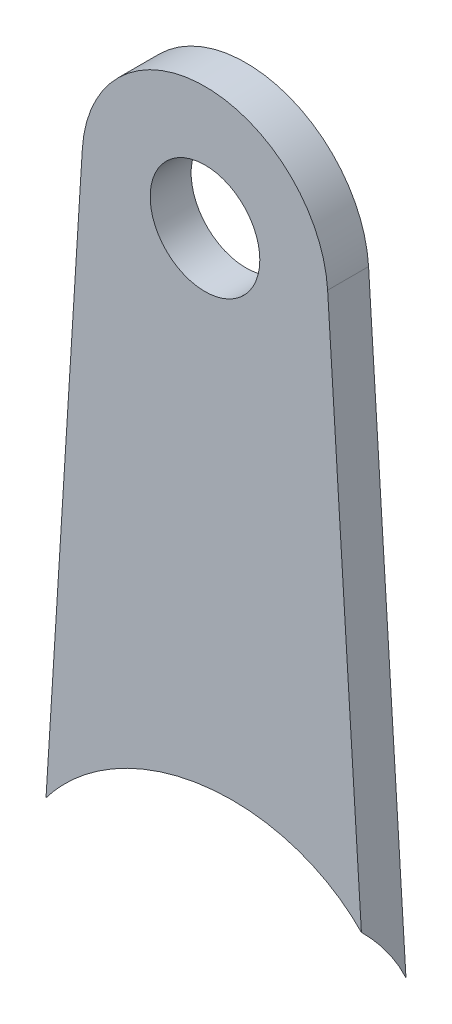
ISO-10303-21;
HEADER;
FILE_DESCRIPTION(('STEP AP214'),'2;1');
FILE_NAME('part.step','',(''),(''),'','','');
FILE_SCHEMA(('AUTOMOTIVE_DESIGN { 1 0 10303 214 1 1 1 1 }'));
ENDSEC;
DATA;
#1=APPLICATION_CONTEXT('core data for automotive mechanical design processes');
#2=APPLICATION_PROTOCOL_DEFINITION('international standard','automotive_design',2000,#1);
#3=PRODUCT_CONTEXT('',#1,'mechanical');
#4=PRODUCT('Part','Part','',(#3));
#5=PRODUCT_RELATED_PRODUCT_CATEGORY('part','',(#4));
#6=PRODUCT_DEFINITION_FORMATION('','',#4);
#7=PRODUCT_DEFINITION_CONTEXT('part definition',#1,'design');
#8=PRODUCT_DEFINITION('design','',#6,#7);
#9=PRODUCT_DEFINITION_SHAPE('','',#8);
#10=(LENGTH_UNIT() NAMED_UNIT(*) SI_UNIT(.MILLI.,.METRE.));
#11=(NAMED_UNIT(*) PLANE_ANGLE_UNIT() SI_UNIT($,.RADIAN.));
#12=(NAMED_UNIT(*) SI_UNIT($,.STERADIAN.) SOLID_ANGLE_UNIT());
#13=UNCERTAINTY_MEASURE_WITH_UNIT(LENGTH_MEASURE(1.E-05),#10,'distance_accuracy_value','');
#14=(GEOMETRIC_REPRESENTATION_CONTEXT(3) GLOBAL_UNCERTAINTY_ASSIGNED_CONTEXT((#13)) GLOBAL_UNIT_ASSIGNED_CONTEXT((#10,
#11,#12)) REPRESENTATION_CONTEXT('',''));
#15=CARTESIAN_POINT('',(0.,0.,0.));
#16=DIRECTION('',(0.,0.,1.));
#17=DIRECTION('',(1.,0.,0.));
#18=AXIS2_PLACEMENT_3D('',#15,#16,#17);
#19=CARTESIAN_POINT('',(-9.50637741735107,0.595326296141552,-3.175));
#20=DIRECTION('',(-0.998044873212711,0.0625014484138113,0.));
#21=DIRECTION('',(-0.0625014484138113,-0.998044873212711,0.));
#22=AXIS2_PLACEMENT_3D('',#19,#20,#21);
#23=PLANE('',#22);
#24=DIRECTION('',(0.0625014484138113,0.998044873212711,0.));
#25=VECTOR('',#24,1.);
#26=CARTESIAN_POINT('',(-9.50637741735107,0.595326296141552,0.));
#27=LINE('',#26,#25);
#28=CARTESIAN_POINT('',(-12.3240433394191,-44.3981434443891,0.));
#29=VERTEX_POINT('',#28);
#30=CARTESIAN_POINT('',(-9.50637741735107,0.595326296141553,0.));
#31=VERTEX_POINT('',#30);
#32=EDGE_CURVE('E48',#29,#31,#27,.T.);
#33=ORIENTED_EDGE('',*,*,#32,.T.);
#34=DIRECTION('',(0.,0.,1.));
#35=VECTOR('',#34,1.);
#36=CARTESIAN_POINT('',(-9.50637741735107,0.595326296141553,-3.175));
#37=LINE('',#36,#35);
#38=CARTESIAN_POINT('',(-9.50637741735107,0.595326296141553,-3.175));
#39=VERTEX_POINT('',#38);
#40=EDGE_CURVE('E101',#39,#31,#37,.T.);
#41=ORIENTED_EDGE('',*,*,#40,.F.);
#42=DIRECTION('',(0.0625014484138113,0.998044873212711,0.));
#43=VECTOR('',#42,1.);
#44=CARTESIAN_POINT('',(-9.50637741735107,0.595326296141552,-3.175));
#45=LINE('',#44,#43);
#46=CARTESIAN_POINT('',(-12.230088095016,-42.8978334136986,-3.175));
#47=VERTEX_POINT('',#46);
#48=EDGE_CURVE('E115',#47,#39,#45,.T.);
#49=ORIENTED_EDGE('',*,*,#48,.F.);
#50=CARTESIAN_POINT('',(-13.0371618119993,-55.7854673163059,-20.0662296507242));
#51=DIRECTION('',(0.998044873212711,-0.0625014484138113,0.));
#52=DIRECTION('',(0.0182386214460947,0.291240652668135,0.956475945814209));
#53=AXIS2_PLACEMENT_3D('',#50,#51,#52);
#54=ELLIPSE('',#53,24.5531990618858,12.7);
#55=EDGE_CURVE('E103',#29,#47,#54,.F.);
#56=ORIENTED_EDGE('',*,*,#55,.F.);
#57=EDGE_LOOP('',(#33,#41,#49,#56));
#58=FACE_BOUND('',#57,.T.);
#59=ADVANCED_FACE('F45',(#58),#23,.T.);
#60=CARTESIAN_POINT('',(9.50637741735107,0.595326296141555,-3.175));
#61=DIRECTION('',(-0.998044873212711,-0.0625014484138115,0.));
#62=DIRECTION('',(0.0625014484138115,-0.998044873212711,0.));
#63=AXIS2_PLACEMENT_3D('',#60,#61,#62);
#64=PLANE('',#63);
#65=CARTESIAN_POINT('',(12.3877374629447,-45.4152333687308,19.0666640768086));
#66=DIRECTION('',(0.998044873212711,0.0625014484138115,0.));
#67=DIRECTION('',(-0.0136544969017709,0.218039757077051,0.975844362102964));
#68=AXIS2_PLACEMENT_3D('',#65,#66,#67);
#69=ELLIPSE('',#68,23.3301226325283,12.7);
#70=CARTESIAN_POINT('',(12.1239681467757,-41.2032731599001,0.));
#71=VERTEX_POINT('',#70);
#72=CARTESIAN_POINT('',(12.4064909578693,-45.7146957002345,-3.175));
#73=VERTEX_POINT('',#72);
#74=EDGE_CURVE('E11',#71,#73,#69,.F.);
#75=ORIENTED_EDGE('',*,*,#74,.T.);
#76=DIRECTION('',(-0.0625014484138115,0.998044873212711,0.));
#77=VECTOR('',#76,1.);
#78=CARTESIAN_POINT('',(9.50637741735107,0.595326296141555,-3.175));
#79=LINE('',#78,#77);
#80=CARTESIAN_POINT('',(9.50637741735107,0.595326296141555,-3.175));
#81=VERTEX_POINT('',#80);
#82=EDGE_CURVE('E105',#73,#81,#79,.T.);
#83=ORIENTED_EDGE('',*,*,#82,.T.);
#84=DIRECTION('',(0.,0.,1.));
#85=VECTOR('',#84,1.);
#86=CARTESIAN_POINT('',(9.50637741735107,0.595326296141555,-3.175));
#87=LINE('',#86,#85);
#88=CARTESIAN_POINT('',(9.50637741735107,0.595326296141555,0.));
#89=VERTEX_POINT('',#88);
#90=EDGE_CURVE('E99',#81,#89,#87,.T.);
#91=ORIENTED_EDGE('',*,*,#90,.T.);
#92=DIRECTION('',(-0.0625014484138115,0.998044873212711,0.));
#93=VECTOR('',#92,1.);
#94=CARTESIAN_POINT('',(9.50637741735107,0.595326296141555,0.));
#95=LINE('',#94,#93);
#96=EDGE_CURVE('E90',#71,#89,#95,.T.);
#97=ORIENTED_EDGE('',*,*,#96,.F.);
#98=EDGE_LOOP('',(#75,#83,#91,#97));
#99=FACE_BOUND('',#98,.T.);
#100=ADVANCED_FACE('F96',(#99),#64,.F.);
#101=CARTESIAN_POINT('',(0.,0.,-3.175));
#102=DIRECTION('',(0.,0.,1.));
#103=DIRECTION('',(-1.,0.,0.));
#104=AXIS2_PLACEMENT_3D('',#101,#102,#103);
#105=CYLINDRICAL_SURFACE('',#104,9.525);
#106=CARTESIAN_POINT('',(0.,0.,0.));
#107=DIRECTION('',(0.,0.,1.));
#108=DIRECTION('',(1.,0.,0.));
#109=AXIS2_PLACEMENT_3D('',#106,#107,#108);
#110=CIRCLE('',#109,9.525);
#111=EDGE_CURVE('E100',#89,#31,#110,.T.);
#112=ORIENTED_EDGE('',*,*,#111,.F.);
#113=ORIENTED_EDGE('',*,*,#90,.F.);
#114=CARTESIAN_POINT('',(0.,0.,-3.175));
#115=DIRECTION('',(0.,0.,1.));
#116=DIRECTION('',(1.,0.,0.));
#117=AXIS2_PLACEMENT_3D('',#114,#115,#116);
#118=CIRCLE('',#117,9.525);
#119=EDGE_CURVE('E110',#81,#39,#118,.T.);
#120=ORIENTED_EDGE('',*,*,#119,.T.);
#121=ORIENTED_EDGE('',*,*,#40,.T.);
#122=EDGE_LOOP('',(#112,#113,#120,#121));
#123=FACE_BOUND('',#122,.T.);
#124=ADVANCED_FACE('F131',(#123),#105,.T.);
#125=CARTESIAN_POINT('',(0.,0.,-3.175));
#126=DIRECTION('',(0.,0.,1.));
#127=DIRECTION('',(-1.,0.,0.));
#128=AXIS2_PLACEMENT_3D('',#125,#126,#127);
#129=CYLINDRICAL_SURFACE('',#128,4.25);
#130=CARTESIAN_POINT('',(0.,0.,-3.175));
#131=DIRECTION('',(0.,0.,1.));
#132=DIRECTION('',(1.,0.,0.));
#133=AXIS2_PLACEMENT_3D('',#130,#131,#132);
#134=CIRCLE('',#133,4.25);
#135=CARTESIAN_POINT('',(4.25,0.,-3.175));
#136=VERTEX_POINT('',#135);
#137=EDGE_CURVE('E106',#136,#136,#134,.T.);
#138=ORIENTED_EDGE('',*,*,#137,.F.);
#139=EDGE_LOOP('',(#138));
#140=FACE_BOUND('',#139,.T.);
#141=CARTESIAN_POINT('',(0.,0.,0.));
#142=DIRECTION('',(0.,0.,1.));
#143=DIRECTION('',(1.,0.,0.));
#144=AXIS2_PLACEMENT_3D('',#141,#142,#143);
#145=CIRCLE('',#144,4.25);
#146=CARTESIAN_POINT('',(4.25,0.,0.));
#147=VERTEX_POINT('',#146);
#148=EDGE_CURVE('E93',#147,#147,#145,.T.);
#149=ORIENTED_EDGE('',*,*,#148,.T.);
#150=EDGE_LOOP('',(#149));
#151=FACE_BOUND('',#150,.T.);
#152=ADVANCED_FACE('F128',(#140,#151),#129,.F.);
#153=CARTESIAN_POINT('',(0.,0.,-3.175));
#154=DIRECTION('',(0.,0.,-1.));
#155=DIRECTION('',(1.,0.,0.));
#156=AXIS2_PLACEMENT_3D('',#153,#154,#155);
#157=PLANE('',#156);
#158=ORIENTED_EDGE('',*,*,#48,.T.);
#159=ORIENTED_EDGE('',*,*,#119,.F.);
#160=ORIENTED_EDGE('',*,*,#82,.F.);
#161=CARTESIAN_POINT('',(-2.06281845038238,-51.3092840736395,-3.17500000000001));
#162=DIRECTION('',(0.,0.,1.));
#163=DIRECTION('',(0.925940325935361,0.377669846303248,0.));
#164=AXIS2_PLACEMENT_3D('',#161,#162,#163);
#165=ELLIPSE('',#164,15.5145140746698,12.7);
#166=EDGE_CURVE('E63',#47,#73,#165,.F.);
#167=ORIENTED_EDGE('',*,*,#166,.F.);
#168=EDGE_LOOP('',(#158,#159,#160,#167));
#169=FACE_BOUND('',#168,.T.);
#170=ORIENTED_EDGE('',*,*,#137,.T.);
#171=EDGE_LOOP('',(#170));
#172=FACE_BOUND('',#171,.T.);
#173=ADVANCED_FACE('F108',(#169,#172),#157,.T.);
#174=CARTESIAN_POINT('',(0.,0.,0.));
#175=DIRECTION('',(0.,0.,-1.));
#176=DIRECTION('',(1.,0.,0.));
#177=AXIS2_PLACEMENT_3D('',#174,#175,#176);
#178=PLANE('',#177);
#179=CARTESIAN_POINT('',(-1.5404344466674E-12,-50.4679076854583,0.));
#180=DIRECTION('',(0.,0.,1.));
#181=DIRECTION('',(0.925940325935361,0.377669846303248,0.));
#182=AXIS2_PLACEMENT_3D('',#179,#180,#181);
#183=ELLIPSE('',#182,15.5145140746698,12.7);
#184=EDGE_CURVE('E54',#29,#71,#183,.F.);
#185=ORIENTED_EDGE('',*,*,#184,.T.);
#186=ORIENTED_EDGE('',*,*,#96,.T.);
#187=ORIENTED_EDGE('',*,*,#111,.T.);
#188=ORIENTED_EDGE('',*,*,#32,.F.);
#189=EDGE_LOOP('',(#185,#186,#187,#188));
#190=FACE_BOUND('',#189,.T.);
#191=ORIENTED_EDGE('',*,*,#148,.F.);
#192=EDGE_LOOP('',(#191));
#193=FACE_BOUND('',#192,.T.);
#194=ADVANCED_FACE('F88',(#190,#193),#178,.F.);
#195=CARTESIAN_POINT('',(-123.025911317865,-100.647358474362,-189.356105653459));
#196=DIRECTION('',(0.531842232493444,0.2169262625002,0.818588319226511));
#197=DIRECTION('',(0.455152304592379,0.741924356505789,-0.492325734496703));
#198=AXIS2_PLACEMENT_3D('',#195,#196,#197);
#199=CYLINDRICAL_SURFACE('',#198,12.7);
#200=ORIENTED_EDGE('',*,*,#55,.T.);
#201=ORIENTED_EDGE('',*,*,#166,.T.);
#202=ORIENTED_EDGE('',*,*,#74,.F.);
#203=ORIENTED_EDGE('',*,*,#184,.F.);
#204=EDGE_LOOP('',(#200,#201,#202,#203));
#205=FACE_BOUND('',#204,.T.);
#206=ADVANCED_FACE('F102',(#205),#199,.F.);
#207=CLOSED_SHELL('',(#59,#100,#124,#152,#173,#194,#206));
#208=MANIFOLD_SOLID_BREP('B2',#207);
#209=ADVANCED_BREP_SHAPE_REPRESENTATION('',(#18,#208),#14);
#210=SHAPE_DEFINITION_REPRESENTATION(#9,#209);
ENDSEC;
END-ISO-10303-21;
